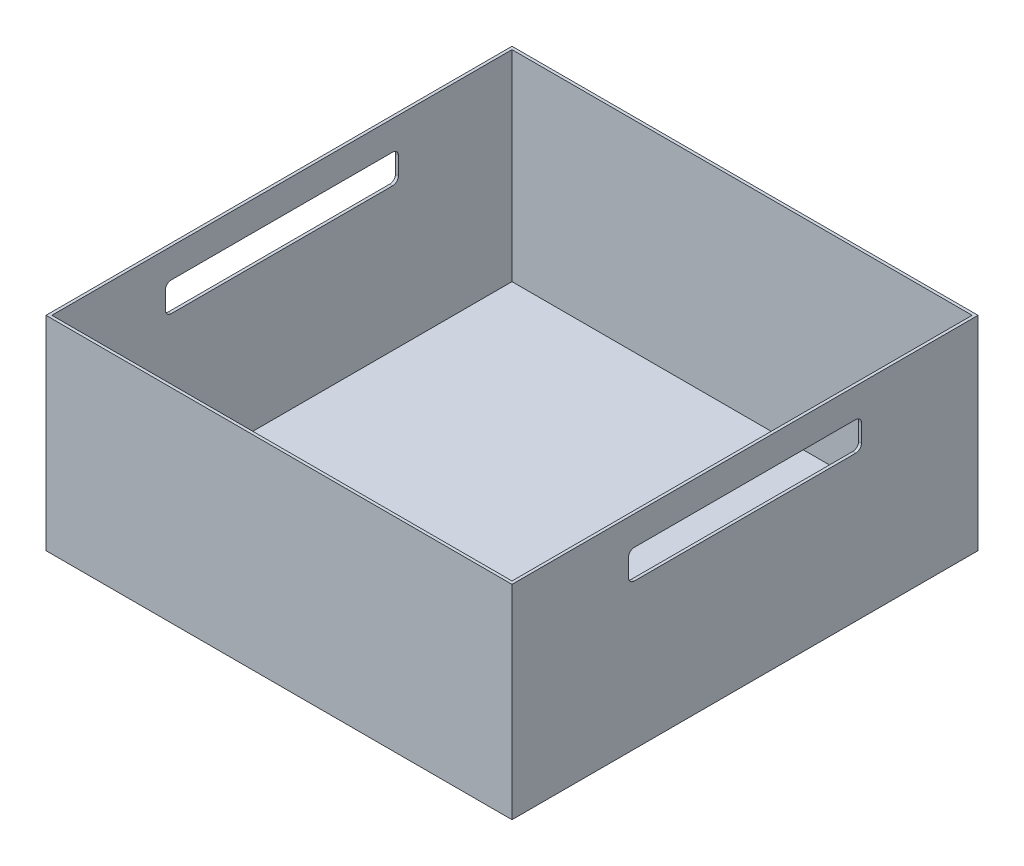
ISO-10303-21;
HEADER;
FILE_DESCRIPTION(('STEP AP214'),'2;1');
FILE_NAME('part.step','',(''),(''),'','','');
FILE_SCHEMA(('AUTOMOTIVE_DESIGN { 1 0 10303 214 1 1 1 1 }'));
ENDSEC;
DATA;
#1=APPLICATION_CONTEXT('core data for automotive mechanical design processes');
#2=APPLICATION_PROTOCOL_DEFINITION('international standard','automotive_design',2000,#1);
#3=PRODUCT_CONTEXT('',#1,'mechanical');
#4=PRODUCT('Part','Part','',(#3));
#5=PRODUCT_RELATED_PRODUCT_CATEGORY('part','',(#4));
#6=PRODUCT_DEFINITION_FORMATION('','',#4);
#7=PRODUCT_DEFINITION_CONTEXT('part definition',#1,'design');
#8=PRODUCT_DEFINITION('design','',#6,#7);
#9=PRODUCT_DEFINITION_SHAPE('','',#8);
#10=(LENGTH_UNIT() NAMED_UNIT(*) SI_UNIT(.MILLI.,.METRE.));
#11=(NAMED_UNIT(*) PLANE_ANGLE_UNIT() SI_UNIT($,.RADIAN.));
#12=(NAMED_UNIT(*) SI_UNIT($,.STERADIAN.) SOLID_ANGLE_UNIT());
#13=UNCERTAINTY_MEASURE_WITH_UNIT(LENGTH_MEASURE(1.E-05),#10,'distance_accuracy_value','');
#14=(GEOMETRIC_REPRESENTATION_CONTEXT(3) GLOBAL_UNCERTAINTY_ASSIGNED_CONTEXT((#13)) GLOBAL_UNIT_ASSIGNED_CONTEXT((#10,
#11,#12)) REPRESENTATION_CONTEXT('',''));
#15=CARTESIAN_POINT('',(0.,0.,0.));
#16=DIRECTION('',(0.,0.,1.));
#17=DIRECTION('',(1.,0.,0.));
#18=AXIS2_PLACEMENT_3D('',#15,#16,#17);
#19=CARTESIAN_POINT('',(0.,350.,0.));
#20=DIRECTION('',(1.,0.,0.));
#21=DIRECTION('',(0.,0.,-1.));
#22=AXIS2_PLACEMENT_3D('',#19,#20,#21);
#23=PLANE('',#22);
#24=DIRECTION('',(0.,0.,1.));
#25=VECTOR('',#24,1.);
#26=CARTESIAN_POINT('',(0.,300.,-210.));
#27=LINE('',#26,#25);
#28=CARTESIAN_POINT('',(0.,300.,-590.));
#29=VERTEX_POINT('',#28);
#30=CARTESIAN_POINT('',(0.,300.,-210.));
#31=VERTEX_POINT('',#30);
#32=EDGE_CURVE('E405',#29,#31,#27,.T.);
#33=ORIENTED_EDGE('',*,*,#32,.T.);
#34=CARTESIAN_POINT('',(0.,290.,-210.));
#35=DIRECTION('',(1.,0.,0.));
#36=DIRECTION('',(0.,0.,-1.));
#37=AXIS2_PLACEMENT_3D('',#34,#35,#36);
#38=CIRCLE('',#37,9.99999999999998);
#39=CARTESIAN_POINT('',(0.,290.,-200.));
#40=VERTEX_POINT('',#39);
#41=EDGE_CURVE('E429',#31,#40,#38,.T.);
#42=ORIENTED_EDGE('',*,*,#41,.T.);
#43=DIRECTION('',(0.,-1.,0.));
#44=VECTOR('',#43,1.);
#45=CARTESIAN_POINT('',(0.,290.,-200.));
#46=LINE('',#45,#44);
#47=CARTESIAN_POINT('',(0.,260.,-200.));
#48=VERTEX_POINT('',#47);
#49=EDGE_CURVE('E176',#40,#48,#46,.T.);
#50=ORIENTED_EDGE('',*,*,#49,.T.);
#51=CARTESIAN_POINT('',(0.,260.,-210.));
#52=DIRECTION('',(1.,0.,0.));
#53=DIRECTION('',(0.,0.,1.));
#54=AXIS2_PLACEMENT_3D('',#51,#52,#53);
#55=CIRCLE('',#54,10.);
#56=CARTESIAN_POINT('',(0.,250.,-210.));
#57=VERTEX_POINT('',#56);
#58=EDGE_CURVE('E57',#48,#57,#55,.T.);
#59=ORIENTED_EDGE('',*,*,#58,.T.);
#60=DIRECTION('',(0.,0.,-1.));
#61=VECTOR('',#60,1.);
#62=CARTESIAN_POINT('',(0.,250.,-210.));
#63=LINE('',#62,#61);
#64=CARTESIAN_POINT('',(0.,250.,-590.));
#65=VERTEX_POINT('',#64);
#66=EDGE_CURVE('E421',#57,#65,#63,.T.);
#67=ORIENTED_EDGE('',*,*,#66,.T.);
#68=CARTESIAN_POINT('',(0.,260.,-590.));
#69=DIRECTION('',(1.,0.,0.));
#70=DIRECTION('',(0.,0.,1.));
#71=AXIS2_PLACEMENT_3D('',#68,#69,#70);
#72=CIRCLE('',#71,10.);
#73=CARTESIAN_POINT('',(0.,260.,-600.));
#74=VERTEX_POINT('',#73);
#75=EDGE_CURVE('E417',#65,#74,#72,.T.);
#76=ORIENTED_EDGE('',*,*,#75,.T.);
#77=DIRECTION('',(0.,1.,0.));
#78=VECTOR('',#77,1.);
#79=CARTESIAN_POINT('',(0.,290.,-600.));
#80=LINE('',#79,#78);
#81=CARTESIAN_POINT('',(0.,290.,-600.));
#82=VERTEX_POINT('',#81);
#83=EDGE_CURVE('E413',#74,#82,#80,.T.);
#84=ORIENTED_EDGE('',*,*,#83,.T.);
#85=CARTESIAN_POINT('',(0.,290.,-590.));
#86=DIRECTION('',(1.,0.,0.));
#87=DIRECTION('',(0.,0.,-1.));
#88=AXIS2_PLACEMENT_3D('',#85,#86,#87);
#89=CIRCLE('',#88,10.);
#90=EDGE_CURVE('E409',#82,#29,#89,.T.);
#91=ORIENTED_EDGE('',*,*,#90,.T.);
#92=EDGE_LOOP('',(#33,#42,#50,#59,#67,#76,#84,#91));
#93=FACE_BOUND('',#92,.T.);
#94=DIRECTION('',(0.,0.,1.));
#95=VECTOR('',#94,1.);
#96=CARTESIAN_POINT('',(0.,0.,0.));
#97=LINE('',#96,#95);
#98=CARTESIAN_POINT('',(0.,0.,-800.));
#99=VERTEX_POINT('',#98);
#100=CARTESIAN_POINT('',(0.,0.,0.));
#101=VERTEX_POINT('',#100);
#102=EDGE_CURVE('E271',#99,#101,#97,.T.);
#103=ORIENTED_EDGE('',*,*,#102,.T.);
#104=DIRECTION('',(0.,-1.,0.));
#105=VECTOR('',#104,1.);
#106=CARTESIAN_POINT('',(0.,350.,0.));
#107=LINE('',#106,#105);
#108=CARTESIAN_POINT('',(0.,350.,0.));
#109=VERTEX_POINT('',#108);
#110=EDGE_CURVE('E318',#109,#101,#107,.T.);
#111=ORIENTED_EDGE('',*,*,#110,.F.);
#112=DIRECTION('',(0.,0.,1.));
#113=VECTOR('',#112,1.);
#114=CARTESIAN_POINT('',(0.,350.,0.));
#115=LINE('',#114,#113);
#116=CARTESIAN_POINT('',(0.,350.,-800.));
#117=VERTEX_POINT('',#116);
#118=EDGE_CURVE('E281',#117,#109,#115,.T.);
#119=ORIENTED_EDGE('',*,*,#118,.F.);
#120=DIRECTION('',(0.,-1.,0.));
#121=VECTOR('',#120,1.);
#122=CARTESIAN_POINT('',(0.,350.,-800.));
#123=LINE('',#122,#121);
#124=EDGE_CURVE('E295',#117,#99,#123,.T.);
#125=ORIENTED_EDGE('',*,*,#124,.T.);
#126=EDGE_LOOP('',(#103,#111,#119,#125));
#127=FACE_BOUND('',#126,.T.);
#128=ADVANCED_FACE('F39',(#93,#127),#23,.F.);
#129=CARTESIAN_POINT('',(0.,350.,0.));
#130=DIRECTION('',(0.,0.,-1.));
#131=DIRECTION('',(-1.,0.,0.));
#132=AXIS2_PLACEMENT_3D('',#129,#130,#131);
#133=PLANE('',#132);
#134=DIRECTION('',(1.,0.,0.));
#135=VECTOR('',#134,1.);
#136=CARTESIAN_POINT('',(0.,0.,0.));
#137=LINE('',#136,#135);
#138=CARTESIAN_POINT('',(800.,0.,0.));
#139=VERTEX_POINT('',#138);
#140=EDGE_CURVE('E299',#101,#139,#137,.T.);
#141=ORIENTED_EDGE('',*,*,#140,.T.);
#142=DIRECTION('',(0.,-1.,0.));
#143=VECTOR('',#142,1.);
#144=CARTESIAN_POINT('',(800.,350.,0.));
#145=LINE('',#144,#143);
#146=CARTESIAN_POINT('',(800.,350.,0.));
#147=VERTEX_POINT('',#146);
#148=EDGE_CURVE('E314',#147,#139,#145,.T.);
#149=ORIENTED_EDGE('',*,*,#148,.F.);
#150=DIRECTION('',(1.,0.,0.));
#151=VECTOR('',#150,1.);
#152=CARTESIAN_POINT('',(0.,350.,0.));
#153=LINE('',#152,#151);
#154=EDGE_CURVE('E285',#109,#147,#153,.T.);
#155=ORIENTED_EDGE('',*,*,#154,.F.);
#156=ORIENTED_EDGE('',*,*,#110,.T.);
#157=EDGE_LOOP('',(#141,#149,#155,#156));
#158=FACE_BOUND('',#157,.T.);
#159=ADVANCED_FACE('F503',(#158),#133,.F.);
#160=CARTESIAN_POINT('',(800.,350.,0.));
#161=DIRECTION('',(-1.,0.,0.));
#162=DIRECTION('',(0.,0.,1.));
#163=AXIS2_PLACEMENT_3D('',#160,#161,#162);
#164=PLANE('',#163);
#165=DIRECTION('',(0.,1.,0.));
#166=VECTOR('',#165,1.);
#167=CARTESIAN_POINT('',(800.,290.,-200.));
#168=LINE('',#167,#166);
#169=CARTESIAN_POINT('',(800.,290.,-200.));
#170=VERTEX_POINT('',#169);
#171=CARTESIAN_POINT('',(800.,260.,-200.));
#172=VERTEX_POINT('',#171);
#173=EDGE_CURVE('E200',#170,#172,#168,.F.);
#174=ORIENTED_EDGE('',*,*,#173,.F.);
#175=CARTESIAN_POINT('',(800.,290.,-210.));
#176=DIRECTION('',(1.,0.,0.));
#177=DIRECTION('',(0.,0.,-1.));
#178=AXIS2_PLACEMENT_3D('',#175,#176,#177);
#179=CIRCLE('',#178,9.99999999999998);
#180=CARTESIAN_POINT('',(800.,300.,-210.));
#181=VERTEX_POINT('',#180);
#182=EDGE_CURVE('E42',#181,#170,#179,.T.);
#183=ORIENTED_EDGE('',*,*,#182,.F.);
#184=DIRECTION('',(0.,0.,1.));
#185=VECTOR('',#184,1.);
#186=CARTESIAN_POINT('',(800.,300.,-210.));
#187=LINE('',#186,#185);
#188=CARTESIAN_POINT('',(800.,300.,-590.));
#189=VERTEX_POINT('',#188);
#190=EDGE_CURVE('E101',#189,#181,#187,.T.);
#191=ORIENTED_EDGE('',*,*,#190,.F.);
#192=CARTESIAN_POINT('',(800.,290.,-590.));
#193=DIRECTION('',(1.,0.,0.));
#194=DIRECTION('',(0.,0.,-1.));
#195=AXIS2_PLACEMENT_3D('',#192,#193,#194);
#196=CIRCLE('',#195,10.);
#197=CARTESIAN_POINT('',(800.,290.,-600.));
#198=VERTEX_POINT('',#197);
#199=EDGE_CURVE('E232',#198,#189,#196,.T.);
#200=ORIENTED_EDGE('',*,*,#199,.F.);
#201=DIRECTION('',(0.,1.,0.));
#202=VECTOR('',#201,1.);
#203=CARTESIAN_POINT('',(800.,290.,-600.));
#204=LINE('',#203,#202);
#205=CARTESIAN_POINT('',(800.,260.,-600.));
#206=VERTEX_POINT('',#205);
#207=EDGE_CURVE('E227',#206,#198,#204,.T.);
#208=ORIENTED_EDGE('',*,*,#207,.F.);
#209=CARTESIAN_POINT('',(800.,260.,-590.));
#210=DIRECTION('',(1.,0.,0.));
#211=DIRECTION('',(0.,0.,-1.));
#212=AXIS2_PLACEMENT_3D('',#209,#210,#211);
#213=CIRCLE('',#212,10.);
#214=CARTESIAN_POINT('',(800.,250.,-590.));
#215=VERTEX_POINT('',#214);
#216=EDGE_CURVE('E222',#215,#206,#213,.T.);
#217=ORIENTED_EDGE('',*,*,#216,.F.);
#218=DIRECTION('',(0.,0.,-1.));
#219=VECTOR('',#218,1.);
#220=CARTESIAN_POINT('',(800.,250.,-210.));
#221=LINE('',#220,#219);
#222=CARTESIAN_POINT('',(800.,250.,-210.));
#223=VERTEX_POINT('',#222);
#224=EDGE_CURVE('E217',#223,#215,#221,.T.);
#225=ORIENTED_EDGE('',*,*,#224,.F.);
#226=CARTESIAN_POINT('',(800.,260.,-210.));
#227=DIRECTION('',(1.,0.,0.));
#228=DIRECTION('',(0.,0.,-1.));
#229=AXIS2_PLACEMENT_3D('',#226,#227,#228);
#230=CIRCLE('',#229,10.);
#231=EDGE_CURVE('E213',#172,#223,#230,.T.);
#232=ORIENTED_EDGE('',*,*,#231,.F.);
#233=EDGE_LOOP('',(#174,#183,#191,#200,#208,#217,#225,#232));
#234=FACE_BOUND('',#233,.T.);
#235=DIRECTION('',(0.,0.,-1.));
#236=VECTOR('',#235,1.);
#237=CARTESIAN_POINT('',(800.,0.,0.));
#238=LINE('',#237,#236);
#239=CARTESIAN_POINT('',(800.,0.,-800.));
#240=VERTEX_POINT('',#239);
#241=EDGE_CURVE('E302',#139,#240,#238,.T.);
#242=ORIENTED_EDGE('',*,*,#241,.T.);
#243=DIRECTION('',(0.,-1.,0.));
#244=VECTOR('',#243,1.);
#245=CARTESIAN_POINT('',(800.,350.,-800.));
#246=LINE('',#245,#244);
#247=CARTESIAN_POINT('',(800.,350.,-800.));
#248=VERTEX_POINT('',#247);
#249=EDGE_CURVE('E310',#248,#240,#246,.T.);
#250=ORIENTED_EDGE('',*,*,#249,.F.);
#251=DIRECTION('',(0.,0.,-1.));
#252=VECTOR('',#251,1.);
#253=CARTESIAN_POINT('',(800.,350.,0.));
#254=LINE('',#253,#252);
#255=EDGE_CURVE('E289',#147,#248,#254,.T.);
#256=ORIENTED_EDGE('',*,*,#255,.F.);
#257=ORIENTED_EDGE('',*,*,#148,.T.);
#258=EDGE_LOOP('',(#242,#250,#256,#257));
#259=FACE_BOUND('',#258,.T.);
#260=ADVANCED_FACE('F367',(#234,#259),#164,.F.);
#261=CARTESIAN_POINT('',(0.,350.,-800.));
#262=DIRECTION('',(0.,0.,1.));
#263=DIRECTION('',(1.,0.,0.));
#264=AXIS2_PLACEMENT_3D('',#261,#262,#263);
#265=PLANE('',#264);
#266=DIRECTION('',(-1.,0.,0.));
#267=VECTOR('',#266,1.);
#268=CARTESIAN_POINT('',(0.,0.,-800.));
#269=LINE('',#268,#267);
#270=EDGE_CURVE('E286',#240,#99,#269,.T.);
#271=ORIENTED_EDGE('',*,*,#270,.T.);
#272=ORIENTED_EDGE('',*,*,#124,.F.);
#273=DIRECTION('',(-1.,0.,0.));
#274=VECTOR('',#273,1.);
#275=CARTESIAN_POINT('',(0.,350.,-800.));
#276=LINE('',#275,#274);
#277=EDGE_CURVE('E292',#248,#117,#276,.T.);
#278=ORIENTED_EDGE('',*,*,#277,.F.);
#279=ORIENTED_EDGE('',*,*,#249,.T.);
#280=EDGE_LOOP('',(#271,#272,#278,#279));
#281=FACE_BOUND('',#280,.T.);
#282=ADVANCED_FACE('F511',(#281),#265,.F.);
#283=CARTESIAN_POINT('',(0.,350.,0.));
#284=DIRECTION('',(0.,-1.,0.));
#285=DIRECTION('',(0.,0.,-1.));
#286=AXIS2_PLACEMENT_3D('',#283,#284,#285);
#287=PLANE('',#286);
#288=DIRECTION('',(1.,0.,0.));
#289=VECTOR('',#288,1.);
#290=CARTESIAN_POINT('',(5.00000000000006,350.,-5.));
#291=LINE('',#290,#289);
#292=CARTESIAN_POINT('',(5.00000000000006,350.,-5.));
#293=VERTEX_POINT('',#292);
#294=CARTESIAN_POINT('',(795.,350.,-5.));
#295=VERTEX_POINT('',#294);
#296=EDGE_CURVE('E257',#293,#295,#291,.T.);
#297=ORIENTED_EDGE('',*,*,#296,.F.);
#298=DIRECTION('',(0.,0.,1.));
#299=VECTOR('',#298,1.);
#300=CARTESIAN_POINT('',(5.,350.,-795.));
#301=LINE('',#300,#299);
#302=CARTESIAN_POINT('',(5.,350.,-795.));
#303=VERTEX_POINT('',#302);
#304=EDGE_CURVE('E254',#303,#293,#301,.T.);
#305=ORIENTED_EDGE('',*,*,#304,.F.);
#306=DIRECTION('',(-1.,0.,0.));
#307=VECTOR('',#306,1.);
#308=CARTESIAN_POINT('',(5.,350.,-795.));
#309=LINE('',#308,#307);
#310=CARTESIAN_POINT('',(795.,350.,-795.));
#311=VERTEX_POINT('',#310);
#312=EDGE_CURVE('E241',#311,#303,#309,.T.);
#313=ORIENTED_EDGE('',*,*,#312,.F.);
#314=DIRECTION('',(0.,0.,-1.));
#315=VECTOR('',#314,1.);
#316=CARTESIAN_POINT('',(795.,350.,-795.));
#317=LINE('',#316,#315);
#318=EDGE_CURVE('E261',#295,#311,#317,.T.);
#319=ORIENTED_EDGE('',*,*,#318,.F.);
#320=EDGE_LOOP('',(#297,#305,#313,#319));
#321=FACE_BOUND('',#320,.T.);
#322=ORIENTED_EDGE('',*,*,#118,.T.);
#323=ORIENTED_EDGE('',*,*,#154,.T.);
#324=ORIENTED_EDGE('',*,*,#255,.T.);
#325=ORIENTED_EDGE('',*,*,#277,.T.);
#326=EDGE_LOOP('',(#322,#323,#324,#325));
#327=FACE_BOUND('',#326,.T.);
#328=ADVANCED_FACE('F516',(#321,#327),#287,.F.);
#329=CARTESIAN_POINT('',(0.,0.,0.));
#330=DIRECTION('',(0.,-1.,0.));
#331=DIRECTION('',(0.,0.,-1.));
#332=AXIS2_PLACEMENT_3D('',#329,#330,#331);
#333=PLANE('',#332);
#334=ORIENTED_EDGE('',*,*,#102,.F.);
#335=ORIENTED_EDGE('',*,*,#270,.F.);
#336=ORIENTED_EDGE('',*,*,#241,.F.);
#337=ORIENTED_EDGE('',*,*,#140,.F.);
#338=EDGE_LOOP('',(#334,#335,#336,#337));
#339=FACE_BOUND('',#338,.T.);
#340=ADVANCED_FACE('F518',(#339),#333,.T.);
#341=CARTESIAN_POINT('',(5.,5.,-795.));
#342=DIRECTION('',(-1.,0.,0.));
#343=DIRECTION('',(0.,0.,1.));
#344=AXIS2_PLACEMENT_3D('',#341,#342,#343);
#345=PLANE('',#344);
#346=DIRECTION('',(0.,1.,0.));
#347=VECTOR('',#346,1.);
#348=CARTESIAN_POINT('',(5.00000000000005,5.,-200.));
#349=LINE('',#348,#347);
#350=CARTESIAN_POINT('',(5.00000000000005,260.,-200.));
#351=VERTEX_POINT('',#350);
#352=CARTESIAN_POINT('',(5.00000000000005,290.,-200.));
#353=VERTEX_POINT('',#352);
#354=EDGE_CURVE('E173',#351,#353,#349,.T.);
#355=ORIENTED_EDGE('',*,*,#354,.T.);
#356=CARTESIAN_POINT('',(5.00000000000005,290.,-210.));
#357=DIRECTION('',(-1.,0.,0.));
#358=DIRECTION('',(0.,0.,1.));
#359=AXIS2_PLACEMENT_3D('',#356,#357,#358);
#360=CIRCLE('',#359,9.99999999999998);
#361=CARTESIAN_POINT('',(5.00000000000003,300.,-210.));
#362=VERTEX_POINT('',#361);
#363=EDGE_CURVE('E185',#353,#362,#360,.T.);
#364=ORIENTED_EDGE('',*,*,#363,.T.);
#365=DIRECTION('',(0.,0.,-1.));
#366=VECTOR('',#365,1.);
#367=CARTESIAN_POINT('',(5.,300.,-795.));
#368=LINE('',#367,#366);
#369=CARTESIAN_POINT('',(5.00000000000002,300.,-590.));
#370=VERTEX_POINT('',#369);
#371=EDGE_CURVE('E233',#362,#370,#368,.T.);
#372=ORIENTED_EDGE('',*,*,#371,.T.);
#373=CARTESIAN_POINT('',(5.00000000000002,290.,-590.));
#374=DIRECTION('',(-1.,0.,0.));
#375=DIRECTION('',(0.,0.,1.));
#376=AXIS2_PLACEMENT_3D('',#373,#374,#375);
#377=CIRCLE('',#376,10.);
#378=CARTESIAN_POINT('',(5.00000000000002,290.,-600.));
#379=VERTEX_POINT('',#378);
#380=EDGE_CURVE('E228',#370,#379,#377,.T.);
#381=ORIENTED_EDGE('',*,*,#380,.T.);
#382=DIRECTION('',(0.,-1.,0.));
#383=VECTOR('',#382,1.);
#384=CARTESIAN_POINT('',(5.00000000000002,5.,-600.));
#385=LINE('',#384,#383);
#386=CARTESIAN_POINT('',(5.00000000000002,260.,-600.));
#387=VERTEX_POINT('',#386);
#388=EDGE_CURVE('E223',#379,#387,#385,.T.);
#389=ORIENTED_EDGE('',*,*,#388,.T.);
#390=CARTESIAN_POINT('',(5.00000000000002,260.,-590.));
#391=DIRECTION('',(-1.,0.,0.));
#392=DIRECTION('',(0.,0.,1.));
#393=AXIS2_PLACEMENT_3D('',#390,#391,#392);
#394=CIRCLE('',#393,10.);
#395=CARTESIAN_POINT('',(5.00000000000003,250.,-590.));
#396=VERTEX_POINT('',#395);
#397=EDGE_CURVE('E218',#387,#396,#394,.T.);
#398=ORIENTED_EDGE('',*,*,#397,.T.);
#399=DIRECTION('',(0.,0.,1.));
#400=VECTOR('',#399,1.);
#401=CARTESIAN_POINT('',(5.,250.,-795.));
#402=LINE('',#401,#400);
#403=CARTESIAN_POINT('',(5.00000000000005,250.,-210.));
#404=VERTEX_POINT('',#403);
#405=EDGE_CURVE('E214',#396,#404,#402,.T.);
#406=ORIENTED_EDGE('',*,*,#405,.T.);
#407=CARTESIAN_POINT('',(5.00000000000005,260.,-210.));
#408=DIRECTION('',(-1.,0.,0.));
#409=DIRECTION('',(0.,0.,1.));
#410=AXIS2_PLACEMENT_3D('',#407,#408,#409);
#411=CIRCLE('',#410,10.);
#412=EDGE_CURVE('E198',#404,#351,#411,.T.);
#413=ORIENTED_EDGE('',*,*,#412,.T.);
#414=EDGE_LOOP('',(#355,#364,#372,#381,#389,#398,#406,#413));
#415=FACE_BOUND('',#414,.T.);
#416=ORIENTED_EDGE('',*,*,#304,.T.);
#417=DIRECTION('',(0.,1.,0.));
#418=VECTOR('',#417,1.);
#419=CARTESIAN_POINT('',(5.00000000000006,5.,-5.));
#420=LINE('',#419,#418);
#421=CARTESIAN_POINT('',(5.00000000000006,5.,-5.));
#422=VERTEX_POINT('',#421);
#423=EDGE_CURVE('E253',#422,#293,#420,.T.);
#424=ORIENTED_EDGE('',*,*,#423,.F.);
#425=DIRECTION('',(0.,0.,1.));
#426=VECTOR('',#425,1.);
#427=CARTESIAN_POINT('',(5.,5.,-795.));
#428=LINE('',#427,#426);
#429=CARTESIAN_POINT('',(5.,5.,-795.));
#430=VERTEX_POINT('',#429);
#431=EDGE_CURVE('E236',#430,#422,#428,.T.);
#432=ORIENTED_EDGE('',*,*,#431,.F.);
#433=DIRECTION('',(0.,1.,0.));
#434=VECTOR('',#433,1.);
#435=CARTESIAN_POINT('',(5.,5.,-795.));
#436=LINE('',#435,#434);
#437=EDGE_CURVE('E268',#430,#303,#436,.T.);
#438=ORIENTED_EDGE('',*,*,#437,.T.);
#439=EDGE_LOOP('',(#416,#424,#432,#438));
#440=FACE_BOUND('',#439,.T.);
#441=ADVANCED_FACE('F194',(#415,#440),#345,.F.);
#442=CARTESIAN_POINT('',(5.,5.,-795.));
#443=DIRECTION('',(0.,0.,-1.));
#444=DIRECTION('',(-1.,0.,0.));
#445=AXIS2_PLACEMENT_3D('',#442,#443,#444);
#446=PLANE('',#445);
#447=ORIENTED_EDGE('',*,*,#312,.T.);
#448=ORIENTED_EDGE('',*,*,#437,.F.);
#449=DIRECTION('',(-1.,0.,0.));
#450=VECTOR('',#449,1.);
#451=CARTESIAN_POINT('',(5.,5.,-795.));
#452=LINE('',#451,#450);
#453=CARTESIAN_POINT('',(795.,5.,-795.));
#454=VERTEX_POINT('',#453);
#455=EDGE_CURVE('E249',#454,#430,#452,.T.);
#456=ORIENTED_EDGE('',*,*,#455,.F.);
#457=DIRECTION('',(0.,1.,0.));
#458=VECTOR('',#457,1.);
#459=CARTESIAN_POINT('',(795.,5.,-795.));
#460=LINE('',#459,#458);
#461=EDGE_CURVE('E272',#454,#311,#460,.T.);
#462=ORIENTED_EDGE('',*,*,#461,.T.);
#463=EDGE_LOOP('',(#447,#448,#456,#462));
#464=FACE_BOUND('',#463,.T.);
#465=ADVANCED_FACE('F527',(#464),#446,.F.);
#466=CARTESIAN_POINT('',(795.,5.,-795.));
#467=DIRECTION('',(1.,0.,0.));
#468=DIRECTION('',(0.,0.,-1.));
#469=AXIS2_PLACEMENT_3D('',#466,#467,#468);
#470=PLANE('',#469);
#471=DIRECTION('',(0.,0.,1.));
#472=VECTOR('',#471,1.);
#473=CARTESIAN_POINT('',(795.,300.,-795.));
#474=LINE('',#473,#472);
#475=CARTESIAN_POINT('',(795.,300.,-590.));
#476=VERTEX_POINT('',#475);
#477=CARTESIAN_POINT('',(795.,300.,-210.));
#478=VERTEX_POINT('',#477);
#479=EDGE_CURVE('E49',#476,#478,#474,.T.);
#480=ORIENTED_EDGE('',*,*,#479,.T.);
#481=CARTESIAN_POINT('',(795.,290.,-210.));
#482=DIRECTION('',(1.,0.,0.));
#483=DIRECTION('',(0.,0.,-1.));
#484=AXIS2_PLACEMENT_3D('',#481,#482,#483);
#485=CIRCLE('',#484,9.99999999999998);
#486=CARTESIAN_POINT('',(795.,290.,-200.));
#487=VERTEX_POINT('',#486);
#488=EDGE_CURVE('E11',#478,#487,#485,.T.);
#489=ORIENTED_EDGE('',*,*,#488,.T.);
#490=DIRECTION('',(0.,-1.,0.));
#491=VECTOR('',#490,1.);
#492=CARTESIAN_POINT('',(795.,5.,-200.));
#493=LINE('',#492,#491);
#494=CARTESIAN_POINT('',(795.,260.,-200.));
#495=VERTEX_POINT('',#494);
#496=EDGE_CURVE('E322',#487,#495,#493,.T.);
#497=ORIENTED_EDGE('',*,*,#496,.T.);
#498=CARTESIAN_POINT('',(795.,260.,-210.));
#499=DIRECTION('',(1.,0.,0.));
#500=DIRECTION('',(0.,0.,-1.));
#501=AXIS2_PLACEMENT_3D('',#498,#499,#500);
#502=CIRCLE('',#501,10.);
#503=CARTESIAN_POINT('',(795.,250.,-210.));
#504=VERTEX_POINT('',#503);
#505=EDGE_CURVE('E326',#495,#504,#502,.T.);
#506=ORIENTED_EDGE('',*,*,#505,.T.);
#507=DIRECTION('',(0.,0.,-1.));
#508=VECTOR('',#507,1.);
#509=CARTESIAN_POINT('',(795.,250.,-795.));
#510=LINE('',#509,#508);
#511=CARTESIAN_POINT('',(795.,250.,-590.));
#512=VERTEX_POINT('',#511);
#513=EDGE_CURVE('E330',#504,#512,#510,.T.);
#514=ORIENTED_EDGE('',*,*,#513,.T.);
#515=CARTESIAN_POINT('',(795.,260.,-590.));
#516=DIRECTION('',(1.,0.,0.));
#517=DIRECTION('',(0.,0.,-1.));
#518=AXIS2_PLACEMENT_3D('',#515,#516,#517);
#519=CIRCLE('',#518,10.);
#520=CARTESIAN_POINT('',(795.,260.,-600.));
#521=VERTEX_POINT('',#520);
#522=EDGE_CURVE('E334',#512,#521,#519,.T.);
#523=ORIENTED_EDGE('',*,*,#522,.T.);
#524=DIRECTION('',(0.,1.,0.));
#525=VECTOR('',#524,1.);
#526=CARTESIAN_POINT('',(795.,5.,-600.));
#527=LINE('',#526,#525);
#528=CARTESIAN_POINT('',(795.,290.,-600.));
#529=VERTEX_POINT('',#528);
#530=EDGE_CURVE('E338',#521,#529,#527,.T.);
#531=ORIENTED_EDGE('',*,*,#530,.T.);
#532=CARTESIAN_POINT('',(795.,290.,-590.));
#533=DIRECTION('',(1.,0.,0.));
#534=DIRECTION('',(0.,0.,-1.));
#535=AXIS2_PLACEMENT_3D('',#532,#533,#534);
#536=CIRCLE('',#535,10.);
#537=EDGE_CURVE('E342',#529,#476,#536,.T.);
#538=ORIENTED_EDGE('',*,*,#537,.T.);
#539=EDGE_LOOP('',(#480,#489,#497,#506,#514,#523,#531,#538));
#540=FACE_BOUND('',#539,.T.);
#541=ORIENTED_EDGE('',*,*,#318,.T.);
#542=ORIENTED_EDGE('',*,*,#461,.F.);
#543=DIRECTION('',(0.,0.,-1.));
#544=VECTOR('',#543,1.);
#545=CARTESIAN_POINT('',(795.,5.,-795.));
#546=LINE('',#545,#544);
#547=CARTESIAN_POINT('',(795.,5.,-5.));
#548=VERTEX_POINT('',#547);
#549=EDGE_CURVE('E245',#548,#454,#546,.T.);
#550=ORIENTED_EDGE('',*,*,#549,.F.);
#551=DIRECTION('',(0.,1.,0.));
#552=VECTOR('',#551,1.);
#553=CARTESIAN_POINT('',(795.,5.,-5.));
#554=LINE('',#553,#552);
#555=EDGE_CURVE('E275',#548,#295,#554,.T.);
#556=ORIENTED_EDGE('',*,*,#555,.T.);
#557=EDGE_LOOP('',(#541,#542,#550,#556));
#558=FACE_BOUND('',#557,.T.);
#559=ADVANCED_FACE('F472',(#540,#558),#470,.F.);
#560=CARTESIAN_POINT('',(5.00000000000006,5.,-5.));
#561=DIRECTION('',(0.,0.,1.));
#562=DIRECTION('',(1.,0.,0.));
#563=AXIS2_PLACEMENT_3D('',#560,#561,#562);
#564=PLANE('',#563);
#565=ORIENTED_EDGE('',*,*,#296,.T.);
#566=ORIENTED_EDGE('',*,*,#555,.F.);
#567=DIRECTION('',(1.,0.,0.));
#568=VECTOR('',#567,1.);
#569=CARTESIAN_POINT('',(5.00000000000006,5.,-5.));
#570=LINE('',#569,#568);
#571=EDGE_CURVE('E240',#422,#548,#570,.T.);
#572=ORIENTED_EDGE('',*,*,#571,.F.);
#573=ORIENTED_EDGE('',*,*,#423,.T.);
#574=EDGE_LOOP('',(#565,#566,#572,#573));
#575=FACE_BOUND('',#574,.T.);
#576=ADVANCED_FACE('F528',(#575),#564,.F.);
#577=CARTESIAN_POINT('',(0.,5.,0.));
#578=DIRECTION('',(0.,1.,0.));
#579=DIRECTION('',(0.,0.,1.));
#580=AXIS2_PLACEMENT_3D('',#577,#578,#579);
#581=PLANE('',#580);
#582=ORIENTED_EDGE('',*,*,#431,.T.);
#583=ORIENTED_EDGE('',*,*,#571,.T.);
#584=ORIENTED_EDGE('',*,*,#549,.T.);
#585=ORIENTED_EDGE('',*,*,#455,.T.);
#586=EDGE_LOOP('',(#582,#583,#584,#585));
#587=FACE_BOUND('',#586,.T.);
#588=ADVANCED_FACE('F531',(#587),#581,.T.);
#589=CARTESIAN_POINT('',(0.,290.,-200.));
#590=DIRECTION('',(0.,0.,1.));
#591=DIRECTION('',(1.,0.,0.));
#592=AXIS2_PLACEMENT_3D('',#589,#590,#591);
#593=PLANE('',#592);
#594=DIRECTION('',(1.,0.,0.));
#595=VECTOR('',#594,1.);
#596=CARTESIAN_POINT('',(0.,260.,-200.));
#597=LINE('',#596,#595);
#598=EDGE_CURVE('E162',#495,#172,#597,.T.);
#599=ORIENTED_EDGE('',*,*,#598,.F.);
#600=ORIENTED_EDGE('',*,*,#496,.F.);
#601=DIRECTION('',(1.,0.,0.));
#602=VECTOR('',#601,1.);
#603=CARTESIAN_POINT('',(0.,290.,-200.));
#604=LINE('',#603,#602);
#605=EDGE_CURVE('E181',#487,#170,#604,.T.);
#606=ORIENTED_EDGE('',*,*,#605,.T.);
#607=ORIENTED_EDGE('',*,*,#173,.T.);
#608=EDGE_LOOP('',(#599,#600,#606,#607));
#609=FACE_BOUND('',#608,.T.);
#610=ADVANCED_FACE('F370',(#609),#593,.F.);
#611=CARTESIAN_POINT('',(0.,260.,-210.));
#612=DIRECTION('',(1.,0.,0.));
#613=DIRECTION('',(0.,0.,-1.));
#614=AXIS2_PLACEMENT_3D('',#611,#612,#613);
#615=CYLINDRICAL_SURFACE('',#614,10.);
#616=DIRECTION('',(1.,0.,0.));
#617=VECTOR('',#616,1.);
#618=CARTESIAN_POINT('',(0.,250.,-210.));
#619=LINE('',#618,#617);
#620=EDGE_CURVE('E377',#504,#223,#619,.T.);
#621=ORIENTED_EDGE('',*,*,#620,.F.);
#622=ORIENTED_EDGE('',*,*,#505,.F.);
#623=ORIENTED_EDGE('',*,*,#598,.T.);
#624=ORIENTED_EDGE('',*,*,#231,.T.);
#625=EDGE_LOOP('',(#621,#622,#623,#624));
#626=FACE_BOUND('',#625,.T.);
#627=ADVANCED_FACE('F373',(#626),#615,.F.);
#628=CARTESIAN_POINT('',(0.,250.,-210.));
#629=DIRECTION('',(0.,-1.,0.));
#630=DIRECTION('',(0.,0.,-1.));
#631=AXIS2_PLACEMENT_3D('',#628,#629,#630);
#632=PLANE('',#631);
#633=DIRECTION('',(1.,0.,0.));
#634=VECTOR('',#633,1.);
#635=CARTESIAN_POINT('',(0.,250.,-590.));
#636=LINE('',#635,#634);
#637=EDGE_CURVE('E384',#512,#215,#636,.T.);
#638=ORIENTED_EDGE('',*,*,#637,.F.);
#639=ORIENTED_EDGE('',*,*,#513,.F.);
#640=ORIENTED_EDGE('',*,*,#620,.T.);
#641=ORIENTED_EDGE('',*,*,#224,.T.);
#642=EDGE_LOOP('',(#638,#639,#640,#641));
#643=FACE_BOUND('',#642,.T.);
#644=ADVANCED_FACE('F488',(#643),#632,.F.);
#645=CARTESIAN_POINT('',(0.,260.,-590.));
#646=DIRECTION('',(1.,0.,0.));
#647=DIRECTION('',(0.,0.,-1.));
#648=AXIS2_PLACEMENT_3D('',#645,#646,#647);
#649=CYLINDRICAL_SURFACE('',#648,10.);
#650=DIRECTION('',(1.,0.,0.));
#651=VECTOR('',#650,1.);
#652=CARTESIAN_POINT('',(0.,260.,-600.));
#653=LINE('',#652,#651);
#654=EDGE_CURVE('E390',#521,#206,#653,.T.);
#655=ORIENTED_EDGE('',*,*,#654,.F.);
#656=ORIENTED_EDGE('',*,*,#522,.F.);
#657=ORIENTED_EDGE('',*,*,#637,.T.);
#658=ORIENTED_EDGE('',*,*,#216,.T.);
#659=EDGE_LOOP('',(#655,#656,#657,#658));
#660=FACE_BOUND('',#659,.T.);
#661=ADVANCED_FACE('F480',(#660),#649,.F.);
#662=CARTESIAN_POINT('',(0.,290.,-600.));
#663=DIRECTION('',(0.,0.,-1.));
#664=DIRECTION('',(-1.,0.,0.));
#665=AXIS2_PLACEMENT_3D('',#662,#663,#664);
#666=PLANE('',#665);
#667=DIRECTION('',(1.,0.,0.));
#668=VECTOR('',#667,1.);
#669=CARTESIAN_POINT('',(0.,290.,-600.));
#670=LINE('',#669,#668);
#671=EDGE_CURVE('E395',#529,#198,#670,.T.);
#672=ORIENTED_EDGE('',*,*,#671,.F.);
#673=ORIENTED_EDGE('',*,*,#530,.F.);
#674=ORIENTED_EDGE('',*,*,#654,.T.);
#675=ORIENTED_EDGE('',*,*,#207,.T.);
#676=EDGE_LOOP('',(#672,#673,#674,#675));
#677=FACE_BOUND('',#676,.T.);
#678=ADVANCED_FACE('F477',(#677),#666,.F.);
#679=CARTESIAN_POINT('',(0.,290.,-590.));
#680=DIRECTION('',(1.,0.,0.));
#681=DIRECTION('',(0.,0.,-1.));
#682=AXIS2_PLACEMENT_3D('',#679,#680,#681);
#683=CYLINDRICAL_SURFACE('',#682,10.);
#684=DIRECTION('',(1.,0.,0.));
#685=VECTOR('',#684,1.);
#686=CARTESIAN_POINT('',(0.,300.,-590.));
#687=LINE('',#686,#685);
#688=EDGE_CURVE('E399',#476,#189,#687,.T.);
#689=ORIENTED_EDGE('',*,*,#688,.F.);
#690=ORIENTED_EDGE('',*,*,#537,.F.);
#691=ORIENTED_EDGE('',*,*,#671,.T.);
#692=ORIENTED_EDGE('',*,*,#199,.T.);
#693=EDGE_LOOP('',(#689,#690,#691,#692));
#694=FACE_BOUND('',#693,.T.);
#695=ADVANCED_FACE('F467',(#694),#683,.F.);
#696=CARTESIAN_POINT('',(0.,300.,-210.));
#697=DIRECTION('',(0.,1.,0.));
#698=DIRECTION('',(0.,0.,1.));
#699=AXIS2_PLACEMENT_3D('',#696,#697,#698);
#700=PLANE('',#699);
#701=DIRECTION('',(1.,0.,0.));
#702=VECTOR('',#701,1.);
#703=CARTESIAN_POINT('',(0.,300.,-210.));
#704=LINE('',#703,#702);
#705=EDGE_CURVE('E205',#478,#181,#704,.T.);
#706=ORIENTED_EDGE('',*,*,#705,.F.);
#707=ORIENTED_EDGE('',*,*,#479,.F.);
#708=ORIENTED_EDGE('',*,*,#688,.T.);
#709=ORIENTED_EDGE('',*,*,#190,.T.);
#710=EDGE_LOOP('',(#706,#707,#708,#709));
#711=FACE_BOUND('',#710,.T.);
#712=ADVANCED_FACE('F464',(#711),#700,.F.);
#713=CARTESIAN_POINT('',(0.,290.,-210.));
#714=DIRECTION('',(1.,0.,0.));
#715=DIRECTION('',(0.,0.,-1.));
#716=AXIS2_PLACEMENT_3D('',#713,#714,#715);
#717=CYLINDRICAL_SURFACE('',#716,9.99999999999998);
#718=ORIENTED_EDGE('',*,*,#605,.F.);
#719=ORIENTED_EDGE('',*,*,#488,.F.);
#720=ORIENTED_EDGE('',*,*,#705,.T.);
#721=ORIENTED_EDGE('',*,*,#182,.T.);
#722=EDGE_LOOP('',(#718,#719,#720,#721));
#723=FACE_BOUND('',#722,.T.);
#724=ADVANCED_FACE('F363',(#723),#717,.F.);
#725=EDGE_CURVE('E169',#40,#353,#604,.T.);
#726=ORIENTED_EDGE('',*,*,#725,.F.);
#727=ORIENTED_EDGE('',*,*,#41,.F.);
#728=EDGE_CURVE('E188',#31,#362,#704,.T.);
#729=ORIENTED_EDGE('',*,*,#728,.T.);
#730=ORIENTED_EDGE('',*,*,#363,.F.);
#731=EDGE_LOOP('',(#726,#727,#729,#730));
#732=FACE_BOUND('',#731,.T.);
#733=ADVANCED_FACE('F186',(#732),#717,.F.);
#734=ORIENTED_EDGE('',*,*,#728,.F.);
#735=ORIENTED_EDGE('',*,*,#32,.F.);
#736=EDGE_CURVE('E401',#29,#370,#687,.T.);
#737=ORIENTED_EDGE('',*,*,#736,.T.);
#738=ORIENTED_EDGE('',*,*,#371,.F.);
#739=EDGE_LOOP('',(#734,#735,#737,#738));
#740=FACE_BOUND('',#739,.T.);
#741=ADVANCED_FACE('F568',(#740),#700,.F.);
#742=ORIENTED_EDGE('',*,*,#736,.F.);
#743=ORIENTED_EDGE('',*,*,#90,.F.);
#744=EDGE_CURVE('E396',#82,#379,#670,.T.);
#745=ORIENTED_EDGE('',*,*,#744,.T.);
#746=ORIENTED_EDGE('',*,*,#380,.F.);
#747=EDGE_LOOP('',(#742,#743,#745,#746));
#748=FACE_BOUND('',#747,.T.);
#749=ADVANCED_FACE('F567',(#748),#683,.F.);
#750=ORIENTED_EDGE('',*,*,#744,.F.);
#751=ORIENTED_EDGE('',*,*,#83,.F.);
#752=EDGE_CURVE('E391',#74,#387,#653,.T.);
#753=ORIENTED_EDGE('',*,*,#752,.T.);
#754=ORIENTED_EDGE('',*,*,#388,.F.);
#755=EDGE_LOOP('',(#750,#751,#753,#754));
#756=FACE_BOUND('',#755,.T.);
#757=ADVANCED_FACE('F565',(#756),#666,.F.);
#758=ORIENTED_EDGE('',*,*,#752,.F.);
#759=ORIENTED_EDGE('',*,*,#75,.F.);
#760=EDGE_CURVE('E386',#65,#396,#636,.T.);
#761=ORIENTED_EDGE('',*,*,#760,.T.);
#762=ORIENTED_EDGE('',*,*,#397,.F.);
#763=EDGE_LOOP('',(#758,#759,#761,#762));
#764=FACE_BOUND('',#763,.T.);
#765=ADVANCED_FACE('F497',(#764),#649,.F.);
#766=ORIENTED_EDGE('',*,*,#760,.F.);
#767=ORIENTED_EDGE('',*,*,#66,.F.);
#768=EDGE_CURVE('E379',#57,#404,#619,.T.);
#769=ORIENTED_EDGE('',*,*,#768,.T.);
#770=ORIENTED_EDGE('',*,*,#405,.F.);
#771=EDGE_LOOP('',(#766,#767,#769,#770));
#772=FACE_BOUND('',#771,.T.);
#773=ADVANCED_FACE('F491',(#772),#632,.F.);
#774=ORIENTED_EDGE('',*,*,#768,.F.);
#775=ORIENTED_EDGE('',*,*,#58,.F.);
#776=EDGE_CURVE('E209',#48,#351,#597,.T.);
#777=ORIENTED_EDGE('',*,*,#776,.T.);
#778=ORIENTED_EDGE('',*,*,#412,.F.);
#779=EDGE_LOOP('',(#774,#775,#777,#778));
#780=FACE_BOUND('',#779,.T.);
#781=ADVANCED_FACE('F499',(#780),#615,.F.);
#782=ORIENTED_EDGE('',*,*,#776,.F.);
#783=ORIENTED_EDGE('',*,*,#49,.F.);
#784=ORIENTED_EDGE('',*,*,#725,.T.);
#785=ORIENTED_EDGE('',*,*,#354,.F.);
#786=EDGE_LOOP('',(#782,#783,#784,#785));
#787=FACE_BOUND('',#786,.T.);
#788=ADVANCED_FACE('F171',(#787),#593,.F.);
#789=CLOSED_SHELL('',(#128,#159,#260,#282,#328,#340,#441,#465,#559,#576,#588,#610,#627,#644,
#661,#678,#695,#712,#724,#733,#741,#749,#757,#765,#773,#781,#788));
#790=MANIFOLD_SOLID_BREP('B2',#789);
#791=ADVANCED_BREP_SHAPE_REPRESENTATION('',(#18,#790),#14);
#792=SHAPE_DEFINITION_REPRESENTATION(#9,#791);
ENDSEC;
END-ISO-10303-21;
